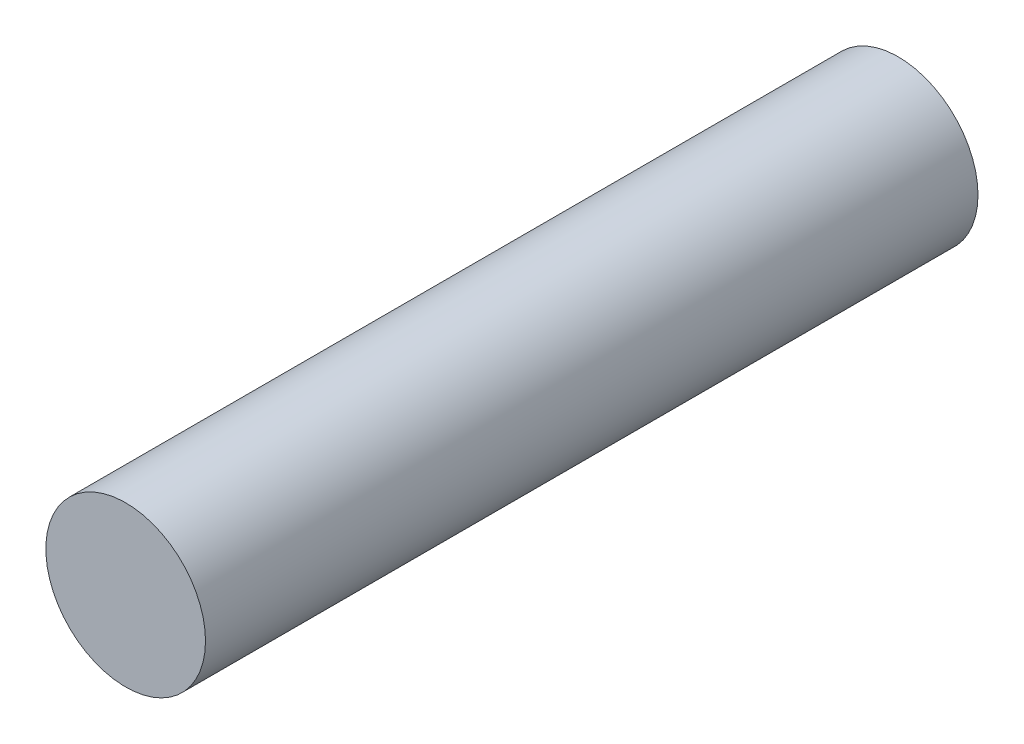
ISO-10303-21;
HEADER;
FILE_DESCRIPTION(('STEP AP214'),'2;1');
FILE_NAME('part.step','',(''),(''),'','','');
FILE_SCHEMA(('AUTOMOTIVE_DESIGN { 1 0 10303 214 1 1 1 1 }'));
ENDSEC;
DATA;
#1=APPLICATION_CONTEXT('core data for automotive mechanical design processes');
#2=APPLICATION_PROTOCOL_DEFINITION('international standard','automotive_design',2000,#1);
#3=PRODUCT_CONTEXT('',#1,'mechanical');
#4=PRODUCT('Part','Part','',(#3));
#5=PRODUCT_RELATED_PRODUCT_CATEGORY('part','',(#4));
#6=PRODUCT_DEFINITION_FORMATION('','',#4);
#7=PRODUCT_DEFINITION_CONTEXT('part definition',#1,'design');
#8=PRODUCT_DEFINITION('design','',#6,#7);
#9=PRODUCT_DEFINITION_SHAPE('','',#8);
#10=(LENGTH_UNIT() NAMED_UNIT(*) SI_UNIT(.MILLI.,.METRE.));
#11=(NAMED_UNIT(*) PLANE_ANGLE_UNIT() SI_UNIT($,.RADIAN.));
#12=(NAMED_UNIT(*) SI_UNIT($,.STERADIAN.) SOLID_ANGLE_UNIT());
#13=UNCERTAINTY_MEASURE_WITH_UNIT(LENGTH_MEASURE(1.E-05),#10,'distance_accuracy_value','');
#14=(GEOMETRIC_REPRESENTATION_CONTEXT(3) GLOBAL_UNCERTAINTY_ASSIGNED_CONTEXT((#13)) GLOBAL_UNIT_ASSIGNED_CONTEXT((#10,
#11,#12)) REPRESENTATION_CONTEXT('',''));
#15=CARTESIAN_POINT('',(0.,0.,0.));
#16=DIRECTION('',(0.,0.,1.));
#17=DIRECTION('',(1.,0.,0.));
#18=AXIS2_PLACEMENT_3D('',#15,#16,#17);
#19=CARTESIAN_POINT('',(0.,0.,150.));
#20=DIRECTION('',(0.,0.,-1.));
#21=DIRECTION('',(-1.,0.,0.));
#22=AXIS2_PLACEMENT_3D('',#19,#20,#21);
#23=CYLINDRICAL_SURFACE('',#22,31.);
#24=CARTESIAN_POINT('',(0.,0.,150.));
#25=DIRECTION('',(0.,0.,1.));
#26=DIRECTION('',(1.,0.,0.));
#27=AXIS2_PLACEMENT_3D('',#24,#25,#26);
#28=CIRCLE('',#27,31.);
#29=CARTESIAN_POINT('',(31.,0.,150.));
#30=VERTEX_POINT('',#29);
#31=EDGE_CURVE('E10',#30,#30,#28,.T.);
#32=ORIENTED_EDGE('',*,*,#31,.F.);
#33=EDGE_LOOP('',(#32));
#34=FACE_BOUND('',#33,.T.);
#35=CARTESIAN_POINT('',(0.,0.,-150.));
#36=DIRECTION('',(0.,0.,1.));
#37=DIRECTION('',(1.,0.,0.));
#38=AXIS2_PLACEMENT_3D('',#35,#36,#37);
#39=CIRCLE('',#38,31.);
#40=CARTESIAN_POINT('',(31.,0.,-150.));
#41=VERTEX_POINT('',#40);
#42=EDGE_CURVE('E44',#41,#41,#39,.T.);
#43=ORIENTED_EDGE('',*,*,#42,.T.);
#44=EDGE_LOOP('',(#43));
#45=FACE_BOUND('',#44,.T.);
#46=ADVANCED_FACE('F41',(#34,#45),#23,.T.);
#47=CARTESIAN_POINT('',(0.,0.,150.));
#48=DIRECTION('',(0.,0.,1.));
#49=DIRECTION('',(1.,0.,0.));
#50=AXIS2_PLACEMENT_3D('',#47,#48,#49);
#51=PLANE('',#50);
#52=ORIENTED_EDGE('',*,*,#31,.T.);
#53=EDGE_LOOP('',(#52));
#54=FACE_BOUND('',#53,.T.);
#55=ADVANCED_FACE('F58',(#54),#51,.T.);
#56=CARTESIAN_POINT('',(0.,0.,-150.));
#57=DIRECTION('',(0.,0.,1.));
#58=DIRECTION('',(1.,0.,0.));
#59=AXIS2_PLACEMENT_3D('',#56,#57,#58);
#60=PLANE('',#59);
#61=ORIENTED_EDGE('',*,*,#42,.F.);
#62=EDGE_LOOP('',(#61));
#63=FACE_BOUND('',#62,.T.);
#64=ADVANCED_FACE('F56',(#63),#60,.F.);
#65=CLOSED_SHELL('',(#46,#55,#64));
#66=MANIFOLD_SOLID_BREP('B2',#65);
#67=ADVANCED_BREP_SHAPE_REPRESENTATION('',(#18,#66),#14);
#68=SHAPE_DEFINITION_REPRESENTATION(#9,#67);
ENDSEC;
END-ISO-10303-21;
